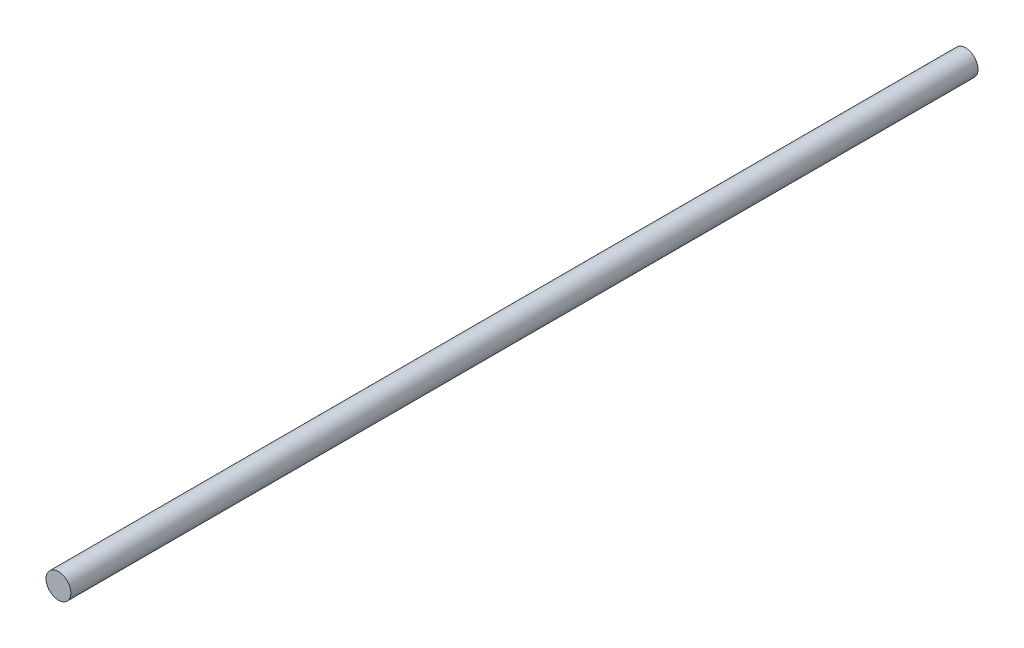
ISO-10303-21;
HEADER;
FILE_DESCRIPTION(('STEP AP214'),'2;1');
FILE_NAME('part.step','',(''),(''),'','','');
FILE_SCHEMA(('AUTOMOTIVE_DESIGN { 1 0 10303 214 1 1 1 1 }'));
ENDSEC;
DATA;
#1=APPLICATION_CONTEXT('core data for automotive mechanical design processes');
#2=APPLICATION_PROTOCOL_DEFINITION('international standard','automotive_design',2000,#1);
#3=PRODUCT_CONTEXT('',#1,'mechanical');
#4=PRODUCT('Part','Part','',(#3));
#5=PRODUCT_RELATED_PRODUCT_CATEGORY('part','',(#4));
#6=PRODUCT_DEFINITION_FORMATION('','',#4);
#7=PRODUCT_DEFINITION_CONTEXT('part definition',#1,'design');
#8=PRODUCT_DEFINITION('design','',#6,#7);
#9=PRODUCT_DEFINITION_SHAPE('','',#8);
#10=(LENGTH_UNIT() NAMED_UNIT(*) SI_UNIT(.MILLI.,.METRE.));
#11=(NAMED_UNIT(*) PLANE_ANGLE_UNIT() SI_UNIT($,.RADIAN.));
#12=(NAMED_UNIT(*) SI_UNIT($,.STERADIAN.) SOLID_ANGLE_UNIT());
#13=UNCERTAINTY_MEASURE_WITH_UNIT(LENGTH_MEASURE(1.E-05),#10,'distance_accuracy_value','');
#14=(GEOMETRIC_REPRESENTATION_CONTEXT(3) GLOBAL_UNCERTAINTY_ASSIGNED_CONTEXT((#13)) GLOBAL_UNIT_ASSIGNED_CONTEXT((#10,
#11,#12)) REPRESENTATION_CONTEXT('',''));
#15=CARTESIAN_POINT('',(0.,0.,0.));
#16=DIRECTION('',(0.,0.,1.));
#17=DIRECTION('',(1.,0.,0.));
#18=AXIS2_PLACEMENT_3D('',#15,#16,#17);
#19=CARTESIAN_POINT('',(0.,0.,730.));
#20=DIRECTION('',(0.,0.,-1.));
#21=DIRECTION('',(-1.,0.,0.));
#22=AXIS2_PLACEMENT_3D('',#19,#20,#21);
#23=CYLINDRICAL_SURFACE('',#22,10.);
#24=CARTESIAN_POINT('',(0.,0.,730.));
#25=DIRECTION('',(0.,0.,1.));
#26=DIRECTION('',(1.,0.,0.));
#27=AXIS2_PLACEMENT_3D('',#24,#25,#26);
#28=CIRCLE('',#27,10.);
#29=CARTESIAN_POINT('',(-10.,0.,730.));
#30=VERTEX_POINT('',#29);
#31=EDGE_CURVE('E10',#30,#30,#28,.T.);
#32=CARTESIAN_POINT('',(0.,0.,0.));
#33=DIRECTION('',(0.,0.,1.));
#34=DIRECTION('',(1.,0.,0.));
#35=AXIS2_PLACEMENT_3D('',#32,#33,#34);
#36=CIRCLE('',#35,10.);
#37=CARTESIAN_POINT('',(-10.,0.,-1.11022302462516E-13));
#38=VERTEX_POINT('',#37);
#39=EDGE_CURVE('E40',#38,#38,#36,.T.);
#40=CARTESIAN_POINT('',(-10.,0.,730.));
#41=CARTESIAN_POINT('',(-10.,0.,722.395833333333));
#42=CARTESIAN_POINT('',(-10.,0.,714.791666666667));
#43=CARTESIAN_POINT('',(-10.,0.,699.583333333333));
#44=CARTESIAN_POINT('',(-10.,0.,691.979166666667));
#45=CARTESIAN_POINT('',(-10.,0.,676.770833333333));
#46=CARTESIAN_POINT('',(-10.,0.,669.166666666667));
#47=CARTESIAN_POINT('',(-10.,0.,653.958333333333));
#48=CARTESIAN_POINT('',(-10.,0.,646.354166666667));
#49=CARTESIAN_POINT('',(-10.,0.,631.145833333333));
#50=CARTESIAN_POINT('',(-10.,0.,623.541666666667));
#51=CARTESIAN_POINT('',(-10.,0.,608.333333333333));
#52=CARTESIAN_POINT('',(-10.,0.,600.729166666667));
#53=CARTESIAN_POINT('',(-10.,0.,585.520833333333));
#54=CARTESIAN_POINT('',(-10.,0.,577.916666666667));
#55=CARTESIAN_POINT('',(-10.,0.,562.708333333333));
#56=CARTESIAN_POINT('',(-10.,0.,555.104166666667));
#57=CARTESIAN_POINT('',(-10.,0.,539.895833333333));
#58=CARTESIAN_POINT('',(-10.,0.,532.291666666667));
#59=CARTESIAN_POINT('',(-10.,0.,517.083333333333));
#60=CARTESIAN_POINT('',(-10.,0.,509.479166666666));
#61=CARTESIAN_POINT('',(-10.,0.,494.270833333333));
#62=CARTESIAN_POINT('',(-10.,0.,486.666666666667));
#63=CARTESIAN_POINT('',(-10.,0.,471.458333333333));
#64=CARTESIAN_POINT('',(-10.,0.,463.854166666667));
#65=CARTESIAN_POINT('',(-10.,0.,448.645833333333));
#66=CARTESIAN_POINT('',(-10.,0.,441.041666666667));
#67=CARTESIAN_POINT('',(-10.,0.,425.833333333333));
#68=CARTESIAN_POINT('',(-10.,0.,418.229166666667));
#69=CARTESIAN_POINT('',(-10.,0.,403.020833333333));
#70=CARTESIAN_POINT('',(-10.,0.,395.416666666667));
#71=CARTESIAN_POINT('',(-10.,0.,380.208333333333));
#72=CARTESIAN_POINT('',(-10.,0.,372.604166666667));
#73=CARTESIAN_POINT('',(-10.,0.,357.395833333333));
#74=CARTESIAN_POINT('',(-10.,0.,349.791666666667));
#75=CARTESIAN_POINT('',(-10.,0.,334.583333333333));
#76=CARTESIAN_POINT('',(-10.,0.,326.979166666667));
#77=CARTESIAN_POINT('',(-10.,0.,311.770833333333));
#78=CARTESIAN_POINT('',(-10.,0.,304.166666666667));
#79=CARTESIAN_POINT('',(-10.,0.,288.958333333333));
#80=CARTESIAN_POINT('',(-10.,0.,281.354166666667));
#81=CARTESIAN_POINT('',(-10.,0.,266.145833333333));
#82=CARTESIAN_POINT('',(-10.,0.,258.541666666667));
#83=CARTESIAN_POINT('',(-10.,0.,243.333333333333));
#84=CARTESIAN_POINT('',(-10.,0.,235.729166666667));
#85=CARTESIAN_POINT('',(-10.,0.,220.520833333333));
#86=CARTESIAN_POINT('',(-10.,0.,212.916666666667));
#87=CARTESIAN_POINT('',(-10.,0.,197.708333333333));
#88=CARTESIAN_POINT('',(-10.,0.,190.104166666667));
#89=CARTESIAN_POINT('',(-10.,0.,174.895833333333));
#90=CARTESIAN_POINT('',(-10.,0.,167.291666666667));
#91=CARTESIAN_POINT('',(-10.,0.,152.083333333333));
#92=CARTESIAN_POINT('',(-10.,0.,144.479166666667));
#93=CARTESIAN_POINT('',(-10.,0.,129.270833333333));
#94=CARTESIAN_POINT('',(-10.,0.,121.666666666667));
#95=CARTESIAN_POINT('',(-10.,0.,106.458333333333));
#96=CARTESIAN_POINT('',(-10.,0.,98.8541666666666));
#97=CARTESIAN_POINT('',(-10.,0.,83.6458333333333));
#98=CARTESIAN_POINT('',(-10.,0.,76.0416666666666));
#99=CARTESIAN_POINT('',(-10.,0.,60.8333333333333));
#100=CARTESIAN_POINT('',(-10.,0.,53.2291666666666));
#101=CARTESIAN_POINT('',(-10.,0.,38.0208333333332));
#102=CARTESIAN_POINT('',(-10.,0.,30.4166666666666));
#103=CARTESIAN_POINT('',(-10.,0.,15.2083333333332));
#104=CARTESIAN_POINT('',(-10.,0.,7.60416666666656));
#105=CARTESIAN_POINT('',(-10.,0.,-1.11022302462516E-13));
#106=B_SPLINE_CURVE_WITH_KNOTS('',3,(#40,#41,#42,#43,#44,#45,#46,#47,#48,#49,#50,#51,#52,#53,
#54,#55,#56,#57,#58,#59,#60,#61,#62,#63,#64,#65,#66,#67,#68,#69,#70,#71,#72,#73,#74,#75,#76,#77,
#78,#79,#80,#81,#82,#83,#84,#85,#86,#87,#88,#89,#90,#91,#92,#93,#94,#95,#96,#97,#98,#99,#100,
#101,#102,#103,#104,#105),.UNSPECIFIED.,.F.,.F.,(4,2,2,2,2,2,2,2,2,2,2,2,2,2,2,2,2,2,2,2,2,2,2,
2,2,2,2,2,2,2,2,2,4),(0.,22.8125,45.625,68.4375,91.2500000000001,114.0625,136.875,159.6875,
182.5,205.3125,228.125,250.9375,273.75,296.5625,319.375,342.1875,365.,387.8125,410.625,433.4375,
456.25,479.0625,501.875,524.6875,547.5,570.3125,593.125,615.9375,638.75,661.5625,684.375,
707.1875,730.),.UNSPECIFIED.);
#107=EDGE_CURVE('BSEAM37',#30,#38,#106,.T.);
#108=ORIENTED_EDGE('',*,*,#31,.F.);
#109=ORIENTED_EDGE('',*,*,#39,.T.);
#110=ORIENTED_EDGE('',*,*,#107,.T.);
#111=ORIENTED_EDGE('',*,*,#107,.F.);
#112=EDGE_LOOP('',(#108,#110,#109,#111));
#113=FACE_BOUND('',#112,.T.);
#114=ADVANCED_FACE('F37',(#113),#23,.T.);
#115=CARTESIAN_POINT('',(0.,0.,730.));
#116=DIRECTION('',(0.,0.,1.));
#117=DIRECTION('',(1.,0.,0.));
#118=AXIS2_PLACEMENT_3D('',#115,#116,#117);
#119=PLANE('',#118);
#120=ORIENTED_EDGE('',*,*,#31,.T.);
#121=EDGE_LOOP('',(#120));
#122=FACE_BOUND('',#121,.T.);
#123=ADVANCED_FACE('F54',(#122),#119,.T.);
#124=CARTESIAN_POINT('',(0.,0.,0.));
#125=DIRECTION('',(0.,0.,1.));
#126=DIRECTION('',(1.,0.,0.));
#127=AXIS2_PLACEMENT_3D('',#124,#125,#126);
#128=PLANE('',#127);
#129=ORIENTED_EDGE('',*,*,#39,.F.);
#130=EDGE_LOOP('',(#129));
#131=FACE_BOUND('',#130,.T.);
#132=ADVANCED_FACE('F52',(#131),#128,.F.);
#133=CLOSED_SHELL('',(#114,#123,#132));
#134=MANIFOLD_SOLID_BREP('B2',#133);
#135=ADVANCED_BREP_SHAPE_REPRESENTATION('',(#18,#134),#14);
#136=SHAPE_DEFINITION_REPRESENTATION(#9,#135);
ENDSEC;
END-ISO-10303-21;
